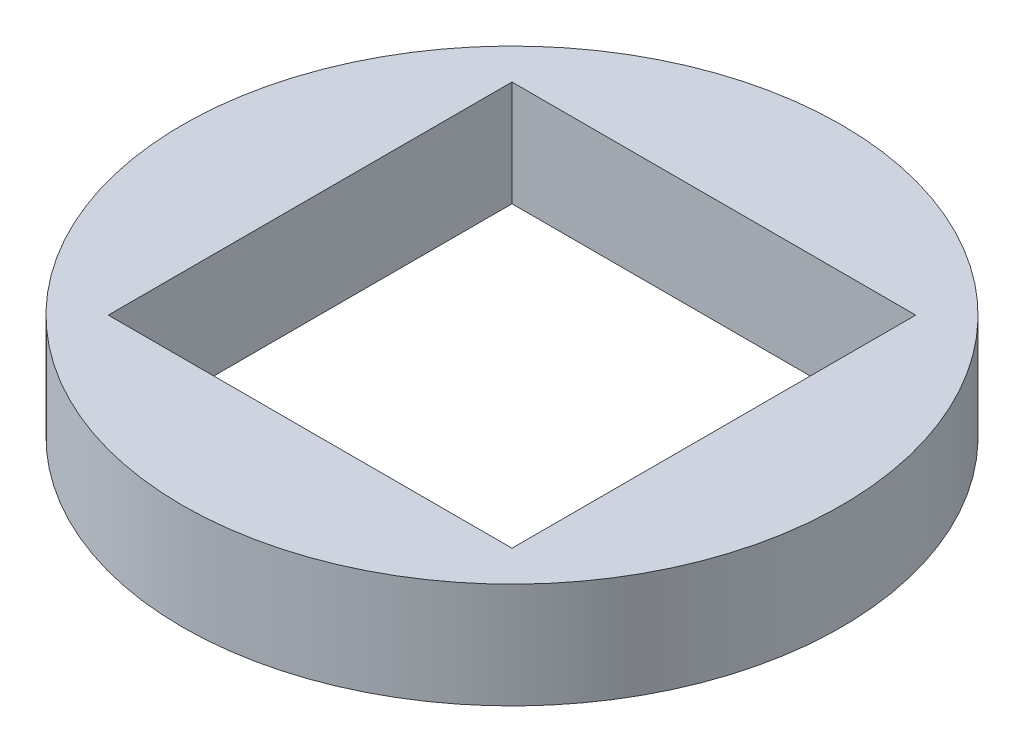
ISO-10303-21;
HEADER;
FILE_DESCRIPTION(('STEP AP214'),'2;1');
FILE_NAME('part.step','',(''),(''),'','','');
FILE_SCHEMA(('AUTOMOTIVE_DESIGN { 1 0 10303 214 1 1 1 1 }'));
ENDSEC;
DATA;
#1=APPLICATION_CONTEXT('core data for automotive mechanical design processes');
#2=APPLICATION_PROTOCOL_DEFINITION('international standard','automotive_design',2000,#1);
#3=PRODUCT_CONTEXT('',#1,'mechanical');
#4=PRODUCT('Part','Part','',(#3));
#5=PRODUCT_RELATED_PRODUCT_CATEGORY('part','',(#4));
#6=PRODUCT_DEFINITION_FORMATION('','',#4);
#7=PRODUCT_DEFINITION_CONTEXT('part definition',#1,'design');
#8=PRODUCT_DEFINITION('design','',#6,#7);
#9=PRODUCT_DEFINITION_SHAPE('','',#8);
#10=(LENGTH_UNIT() NAMED_UNIT(*) SI_UNIT(.MILLI.,.METRE.));
#11=(NAMED_UNIT(*) PLANE_ANGLE_UNIT() SI_UNIT($,.RADIAN.));
#12=(NAMED_UNIT(*) SI_UNIT($,.STERADIAN.) SOLID_ANGLE_UNIT());
#13=UNCERTAINTY_MEASURE_WITH_UNIT(LENGTH_MEASURE(1.E-05),#10,'distance_accuracy_value','');
#14=(GEOMETRIC_REPRESENTATION_CONTEXT(3) GLOBAL_UNCERTAINTY_ASSIGNED_CONTEXT((#13)) GLOBAL_UNIT_ASSIGNED_CONTEXT((#10,
#11,#12)) REPRESENTATION_CONTEXT('',''));
#15=CARTESIAN_POINT('',(0.,0.,0.));
#16=DIRECTION('',(0.,0.,1.));
#17=DIRECTION('',(1.,0.,0.));
#18=AXIS2_PLACEMENT_3D('',#15,#16,#17);
#19=CARTESIAN_POINT('',(0.,2.54,0.));
#20=DIRECTION('',(0.,1.,0.));
#21=DIRECTION('',(0.,0.,1.));
#22=AXIS2_PLACEMENT_3D('',#19,#20,#21);
#23=PLANE('',#22);
#24=CARTESIAN_POINT('',(0.,2.54,0.));
#25=DIRECTION('',(0.,1.,0.));
#26=DIRECTION('',(0.,0.,1.));
#27=AXIS2_PLACEMENT_3D('',#24,#25,#26);
#28=CIRCLE('',#27,7.9375);
#29=CARTESIAN_POINT('',(0.,2.54,7.9375));
#30=VERTEX_POINT('',#29);
#31=EDGE_CURVE('E11',#30,#30,#28,.T.);
#32=ORIENTED_EDGE('',*,*,#31,.T.);
#33=EDGE_LOOP('',(#32));
#34=FACE_BOUND('',#33,.T.);
#35=DIRECTION('',(1.,0.,0.));
#36=VECTOR('',#35,1.);
#37=CARTESIAN_POINT('',(4.86171875,2.54,4.86171875));
#38=LINE('',#37,#36);
#39=CARTESIAN_POINT('',(-4.86171875,2.54,4.86171875));
#40=VERTEX_POINT('',#39);
#41=CARTESIAN_POINT('',(4.86171875,2.54,4.86171875));
#42=VERTEX_POINT('',#41);
#43=EDGE_CURVE('E82',#40,#42,#38,.T.);
#44=ORIENTED_EDGE('',*,*,#43,.F.);
#45=DIRECTION('',(0.,0.,1.));
#46=VECTOR('',#45,1.);
#47=CARTESIAN_POINT('',(-4.86171875,2.54,4.86171875));
#48=LINE('',#47,#46);
#49=CARTESIAN_POINT('',(-4.86171875,2.54,-4.86171875));
#50=VERTEX_POINT('',#49);
#51=EDGE_CURVE('E74',#50,#40,#48,.T.);
#52=ORIENTED_EDGE('',*,*,#51,.F.);
#53=DIRECTION('',(-1.,0.,0.));
#54=VECTOR('',#53,1.);
#55=CARTESIAN_POINT('',(4.86171875,2.54,-4.86171875));
#56=LINE('',#55,#54);
#57=CARTESIAN_POINT('',(4.86171875,2.54,-4.86171875));
#58=VERTEX_POINT('',#57);
#59=EDGE_CURVE('E95',#58,#50,#56,.T.);
#60=ORIENTED_EDGE('',*,*,#59,.F.);
#61=DIRECTION('',(0.,0.,-1.));
#62=VECTOR('',#61,1.);
#63=CARTESIAN_POINT('',(4.86171875,2.54,4.86171875));
#64=LINE('',#63,#62);
#65=EDGE_CURVE('E93',#42,#58,#64,.T.);
#66=ORIENTED_EDGE('',*,*,#65,.F.);
#67=EDGE_LOOP('',(#44,#52,#60,#66));
#68=FACE_BOUND('',#67,.T.);
#69=ADVANCED_FACE('F33',(#34,#68),#23,.T.);
#70=CARTESIAN_POINT('',(0.,0.,0.));
#71=DIRECTION('',(0.,1.,0.));
#72=DIRECTION('',(0.,0.,1.));
#73=AXIS2_PLACEMENT_3D('',#70,#71,#72);
#74=PLANE('',#73);
#75=CARTESIAN_POINT('',(0.,0.,0.));
#76=DIRECTION('',(0.,1.,0.));
#77=DIRECTION('',(0.,0.,1.));
#78=AXIS2_PLACEMENT_3D('',#75,#76,#77);
#79=CIRCLE('',#78,7.9375);
#80=CARTESIAN_POINT('',(0.,0.,7.9375));
#81=VERTEX_POINT('',#80);
#82=EDGE_CURVE('E37',#81,#81,#79,.T.);
#83=ORIENTED_EDGE('',*,*,#82,.F.);
#84=EDGE_LOOP('',(#83));
#85=FACE_BOUND('',#84,.T.);
#86=DIRECTION('',(0.,0.,1.));
#87=VECTOR('',#86,1.);
#88=CARTESIAN_POINT('',(-4.86171875,0.,4.86171875));
#89=LINE('',#88,#87);
#90=CARTESIAN_POINT('',(-4.86171875,0.,-4.86171875));
#91=VERTEX_POINT('',#90);
#92=CARTESIAN_POINT('',(-4.86171875,0.,4.86171875));
#93=VERTEX_POINT('',#92);
#94=EDGE_CURVE('E56',#91,#93,#89,.T.);
#95=ORIENTED_EDGE('',*,*,#94,.T.);
#96=DIRECTION('',(1.,0.,0.));
#97=VECTOR('',#96,1.);
#98=CARTESIAN_POINT('',(4.86171875,0.,4.86171875));
#99=LINE('',#98,#97);
#100=CARTESIAN_POINT('',(4.86171875,0.,4.86171875));
#101=VERTEX_POINT('',#100);
#102=EDGE_CURVE('E89',#93,#101,#99,.T.);
#103=ORIENTED_EDGE('',*,*,#102,.T.);
#104=DIRECTION('',(0.,0.,-1.));
#105=VECTOR('',#104,1.);
#106=CARTESIAN_POINT('',(4.86171875,0.,4.86171875));
#107=LINE('',#106,#105);
#108=CARTESIAN_POINT('',(4.86171875,0.,-4.86171875));
#109=VERTEX_POINT('',#108);
#110=EDGE_CURVE('E101',#101,#109,#107,.T.);
#111=ORIENTED_EDGE('',*,*,#110,.T.);
#112=DIRECTION('',(-1.,0.,0.));
#113=VECTOR('',#112,1.);
#114=CARTESIAN_POINT('',(4.86171875,0.,-4.86171875));
#115=LINE('',#114,#113);
#116=EDGE_CURVE('E83',#109,#91,#115,.T.);
#117=ORIENTED_EDGE('',*,*,#116,.T.);
#118=EDGE_LOOP('',(#95,#103,#111,#117));
#119=FACE_BOUND('',#118,.T.);
#120=ADVANCED_FACE('F112',(#85,#119),#74,.F.);
#121=CARTESIAN_POINT('',(0.,2.54,0.));
#122=DIRECTION('',(0.,-1.,0.));
#123=DIRECTION('',(0.,0.,-1.));
#124=AXIS2_PLACEMENT_3D('',#121,#122,#123);
#125=CYLINDRICAL_SURFACE('',#124,7.9375);
#126=ORIENTED_EDGE('',*,*,#31,.F.);
#127=EDGE_LOOP('',(#126));
#128=FACE_BOUND('',#127,.T.);
#129=ORIENTED_EDGE('',*,*,#82,.T.);
#130=EDGE_LOOP('',(#129));
#131=FACE_BOUND('',#130,.T.);
#132=ADVANCED_FACE('F35',(#128,#131),#125,.T.);
#133=CARTESIAN_POINT('',(-4.86171875,2.54,4.86171875));
#134=DIRECTION('',(1.,0.,0.));
#135=DIRECTION('',(0.,0.,-1.));
#136=AXIS2_PLACEMENT_3D('',#133,#134,#135);
#137=PLANE('',#136);
#138=ORIENTED_EDGE('',*,*,#94,.F.);
#139=DIRECTION('',(0.,-1.,0.));
#140=VECTOR('',#139,1.);
#141=CARTESIAN_POINT('',(-4.86171875,2.54,-4.86171875));
#142=LINE('',#141,#140);
#143=EDGE_CURVE('E78',#50,#91,#142,.T.);
#144=ORIENTED_EDGE('',*,*,#143,.F.);
#145=ORIENTED_EDGE('',*,*,#51,.T.);
#146=DIRECTION('',(0.,-1.,0.));
#147=VECTOR('',#146,1.);
#148=CARTESIAN_POINT('',(-4.86171875,2.54,4.86171875));
#149=LINE('',#148,#147);
#150=EDGE_CURVE('E77',#40,#93,#149,.T.);
#151=ORIENTED_EDGE('',*,*,#150,.T.);
#152=EDGE_LOOP('',(#138,#144,#145,#151));
#153=FACE_BOUND('',#152,.T.);
#154=ADVANCED_FACE('F76',(#153),#137,.T.);
#155=CARTESIAN_POINT('',(4.86171875,2.54,4.86171875));
#156=DIRECTION('',(0.,0.,-1.));
#157=DIRECTION('',(-1.,0.,0.));
#158=AXIS2_PLACEMENT_3D('',#155,#156,#157);
#159=PLANE('',#158);
#160=ORIENTED_EDGE('',*,*,#102,.F.);
#161=ORIENTED_EDGE('',*,*,#150,.F.);
#162=ORIENTED_EDGE('',*,*,#43,.T.);
#163=DIRECTION('',(0.,-1.,0.));
#164=VECTOR('',#163,1.);
#165=CARTESIAN_POINT('',(4.86171875,2.54,4.86171875));
#166=LINE('',#165,#164);
#167=EDGE_CURVE('E90',#42,#101,#166,.T.);
#168=ORIENTED_EDGE('',*,*,#167,.T.);
#169=EDGE_LOOP('',(#160,#161,#162,#168));
#170=FACE_BOUND('',#169,.T.);
#171=ADVANCED_FACE('F86',(#170),#159,.T.);
#172=CARTESIAN_POINT('',(4.86171875,2.54,4.86171875));
#173=DIRECTION('',(-1.,0.,0.));
#174=DIRECTION('',(0.,0.,1.));
#175=AXIS2_PLACEMENT_3D('',#172,#173,#174);
#176=PLANE('',#175);
#177=ORIENTED_EDGE('',*,*,#110,.F.);
#178=ORIENTED_EDGE('',*,*,#167,.F.);
#179=ORIENTED_EDGE('',*,*,#65,.T.);
#180=DIRECTION('',(0.,-1.,0.));
#181=VECTOR('',#180,1.);
#182=CARTESIAN_POINT('',(4.86171875,2.54,-4.86171875));
#183=LINE('',#182,#181);
#184=EDGE_CURVE('E48',#58,#109,#183,.T.);
#185=ORIENTED_EDGE('',*,*,#184,.T.);
#186=EDGE_LOOP('',(#177,#178,#179,#185));
#187=FACE_BOUND('',#186,.T.);
#188=ADVANCED_FACE('F110',(#187),#176,.T.);
#189=CARTESIAN_POINT('',(4.86171875,2.54,-4.86171875));
#190=DIRECTION('',(0.,0.,1.));
#191=DIRECTION('',(1.,0.,0.));
#192=AXIS2_PLACEMENT_3D('',#189,#190,#191);
#193=PLANE('',#192);
#194=ORIENTED_EDGE('',*,*,#116,.F.);
#195=ORIENTED_EDGE('',*,*,#184,.F.);
#196=ORIENTED_EDGE('',*,*,#59,.T.);
#197=ORIENTED_EDGE('',*,*,#143,.T.);
#198=EDGE_LOOP('',(#194,#195,#196,#197));
#199=FACE_BOUND('',#198,.T.);
#200=ADVANCED_FACE('F113',(#199),#193,.T.);
#201=CLOSED_SHELL('',(#69,#120,#132,#154,#171,#188,#200));
#202=MANIFOLD_SOLID_BREP('B2',#201);
#203=ADVANCED_BREP_SHAPE_REPRESENTATION('',(#18,#202),#14);
#204=SHAPE_DEFINITION_REPRESENTATION(#9,#203);
ENDSEC;
END-ISO-10303-21;
